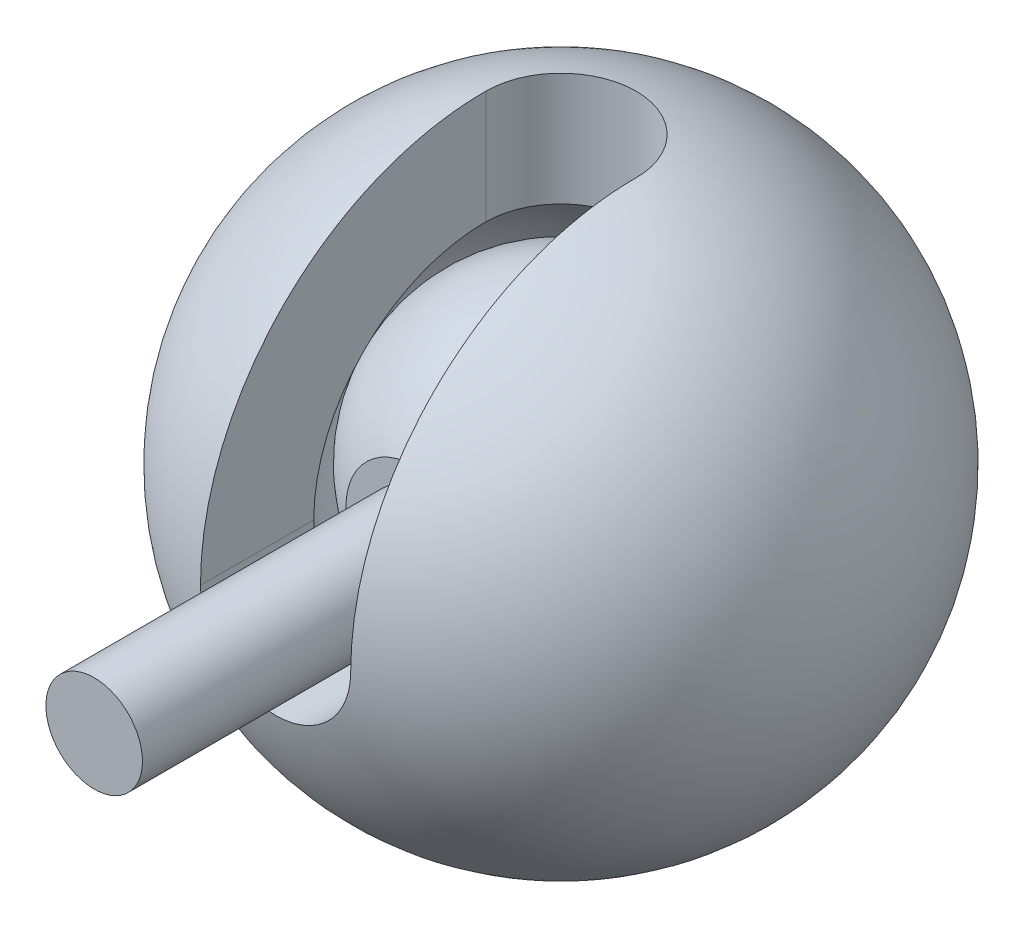
ISO-10303-21;
HEADER;
FILE_DESCRIPTION(('STEP AP214'),'2;1');
FILE_NAME('part.step','',(''),(''),'','','');
FILE_SCHEMA(('AUTOMOTIVE_DESIGN { 1 0 10303 214 1 1 1 1 }'));
ENDSEC;
DATA;
#1=APPLICATION_CONTEXT('core data for automotive mechanical design processes');
#2=APPLICATION_PROTOCOL_DEFINITION('international standard','automotive_design',2000,#1);
#3=PRODUCT_CONTEXT('',#1,'mechanical');
#4=PRODUCT('Part','Part','',(#3));
#5=PRODUCT_RELATED_PRODUCT_CATEGORY('part','',(#4));
#6=PRODUCT_DEFINITION_FORMATION('','',#4);
#7=PRODUCT_DEFINITION_CONTEXT('part definition',#1,'design');
#8=PRODUCT_DEFINITION('design','',#6,#7);
#9=PRODUCT_DEFINITION_SHAPE('','',#8);
#10=(LENGTH_UNIT() NAMED_UNIT(*) SI_UNIT(.MILLI.,.METRE.));
#11=(NAMED_UNIT(*) PLANE_ANGLE_UNIT() SI_UNIT($,.RADIAN.));
#12=(NAMED_UNIT(*) SI_UNIT($,.STERADIAN.) SOLID_ANGLE_UNIT());
#13=UNCERTAINTY_MEASURE_WITH_UNIT(LENGTH_MEASURE(1.E-05),#10,'distance_accuracy_value','');
#14=(GEOMETRIC_REPRESENTATION_CONTEXT(3) GLOBAL_UNCERTAINTY_ASSIGNED_CONTEXT((#13)) GLOBAL_UNIT_ASSIGNED_CONTEXT((#10,
#11,#12)) REPRESENTATION_CONTEXT('',''));
#15=CARTESIAN_POINT('',(0.,0.,0.));
#16=DIRECTION('',(0.,0.,1.));
#17=DIRECTION('',(1.,0.,0.));
#18=AXIS2_PLACEMENT_3D('',#15,#16,#17);
#19=CARTESIAN_POINT('',(0.,0.,0.));
#20=DIRECTION('',(0.,1.,0.));
#21=DIRECTION('',(1.,0.,0.));
#22=AXIS2_PLACEMENT_3D('',#19,#20,#21);
#23=SPHERICAL_SURFACE('',#22,13.75);
#24=CARTESIAN_POINT('',(0.,13.2970861469722,0.));
#25=DIRECTION('',(0.,-1.,0.));
#26=DIRECTION('',(0.,0.,-1.));
#27=AXIS2_PLACEMENT_3D('',#24,#25,#26);
#28=CIRCLE('',#27,3.5);
#29=CARTESIAN_POINT('',(3.5,13.2970861469722,0.));
#30=VERTEX_POINT('',#29);
#31=CARTESIAN_POINT('',(-3.5,13.2970861469722,0.));
#32=VERTEX_POINT('',#31);
#33=EDGE_CURVE('E108',#30,#32,#28,.F.);
#34=ORIENTED_EDGE('',*,*,#33,.F.);
#35=CARTESIAN_POINT('',(3.5,0.,0.));
#36=DIRECTION('',(-1.,0.,0.));
#37=DIRECTION('',(0.,0.,1.));
#38=AXIS2_PLACEMENT_3D('',#35,#36,#37);
#39=CIRCLE('',#38,13.2970861469722);
#40=CARTESIAN_POINT('',(3.5,0.,13.2970861469722));
#41=VERTEX_POINT('',#40);
#42=EDGE_CURVE('E131',#30,#41,#39,.F.);
#43=ORIENTED_EDGE('',*,*,#42,.T.);
#44=CARTESIAN_POINT('',(0.,0.,13.2970861469722));
#45=DIRECTION('',(0.,0.,-1.));
#46=DIRECTION('',(-1.,0.,0.));
#47=AXIS2_PLACEMENT_3D('',#44,#45,#46);
#48=CIRCLE('',#47,3.5);
#49=CARTESIAN_POINT('',(-3.5,0.,13.2970861469722));
#50=VERTEX_POINT('',#49);
#51=EDGE_CURVE('E122',#50,#41,#48,.F.);
#52=ORIENTED_EDGE('',*,*,#51,.F.);
#53=CARTESIAN_POINT('',(-3.5,0.,0.));
#54=DIRECTION('',(1.,0.,0.));
#55=DIRECTION('',(0.,0.,-1.));
#56=AXIS2_PLACEMENT_3D('',#53,#54,#55);
#57=CIRCLE('',#56,13.2970861469722);
#58=EDGE_CURVE('E136',#50,#32,#57,.F.);
#59=ORIENTED_EDGE('',*,*,#58,.T.);
#60=EDGE_LOOP('',(#34,#43,#52,#59));
#61=FACE_BOUND('',#60,.T.);
#62=ADVANCED_FACE('F63',(#61),#23,.T.);
#63=CARTESIAN_POINT('',(0.,0.,0.));
#64=DIRECTION('',(0.,1.,0.));
#65=DIRECTION('',(1.,0.,0.));
#66=AXIS2_PLACEMENT_3D('',#63,#64,#65);
#67=SPHERICAL_SURFACE('',#66,8.75);
#68=CARTESIAN_POINT('',(3.5,0.,0.));
#69=DIRECTION('',(-1.,0.,0.));
#70=DIRECTION('',(0.,0.,1.));
#71=AXIS2_PLACEMENT_3D('',#68,#69,#70);
#72=CIRCLE('',#71,8.01950746617272);
#73=CARTESIAN_POINT('',(3.5,8.01950746617272,0.));
#74=VERTEX_POINT('',#73);
#75=CARTESIAN_POINT('',(3.5,0.,8.01950746617272));
#76=VERTEX_POINT('',#75);
#77=EDGE_CURVE('E12',#74,#76,#72,.F.);
#78=ORIENTED_EDGE('',*,*,#77,.F.);
#79=CARTESIAN_POINT('',(0.,8.01950746617272,0.));
#80=DIRECTION('',(0.,-1.,0.));
#81=DIRECTION('',(0.,0.,-1.));
#82=AXIS2_PLACEMENT_3D('',#79,#80,#81);
#83=CIRCLE('',#82,3.5);
#84=CARTESIAN_POINT('',(-3.5,8.01950746617272,0.));
#85=VERTEX_POINT('',#84);
#86=EDGE_CURVE('E106',#74,#85,#83,.F.);
#87=ORIENTED_EDGE('',*,*,#86,.T.);
#88=CARTESIAN_POINT('',(-3.5,0.,0.));
#89=DIRECTION('',(1.,0.,0.));
#90=DIRECTION('',(0.,0.,-1.));
#91=AXIS2_PLACEMENT_3D('',#88,#89,#90);
#92=CIRCLE('',#91,8.01950746617272);
#93=CARTESIAN_POINT('',(-3.5,0.,8.01950746617272));
#94=VERTEX_POINT('',#93);
#95=EDGE_CURVE('E71',#94,#85,#92,.F.);
#96=ORIENTED_EDGE('',*,*,#95,.F.);
#97=CARTESIAN_POINT('',(0.,0.,8.01950746617272));
#98=DIRECTION('',(0.,0.,-1.));
#99=DIRECTION('',(-1.,0.,0.));
#100=AXIS2_PLACEMENT_3D('',#97,#98,#99);
#101=CIRCLE('',#100,3.5);
#102=EDGE_CURVE('E127',#94,#76,#101,.F.);
#103=ORIENTED_EDGE('',*,*,#102,.T.);
#104=EDGE_LOOP('',(#78,#87,#96,#103));
#105=FACE_BOUND('',#104,.T.);
#106=ADVANCED_FACE('F115',(#105),#67,.F.);
#107=CARTESIAN_POINT('',(0.,0.,6.75));
#108=DIRECTION('',(0.,0.,1.));
#109=DIRECTION('',(1.,0.,0.));
#110=AXIS2_PLACEMENT_3D('',#107,#108,#109);
#111=CYLINDRICAL_SURFACE('',#110,3.5);
#112=ORIENTED_EDGE('',*,*,#51,.T.);
#113=DIRECTION('',(0.,0.,-1.));
#114=VECTOR('',#113,1.);
#115=CARTESIAN_POINT('',(3.5,0.,19.705040631775));
#116=LINE('',#115,#114);
#117=EDGE_CURVE('E111',#41,#76,#116,.T.);
#118=ORIENTED_EDGE('',*,*,#117,.T.);
#119=ORIENTED_EDGE('',*,*,#102,.F.);
#120=DIRECTION('',(0.,0.,1.));
#121=VECTOR('',#120,1.);
#122=CARTESIAN_POINT('',(-3.5,0.,19.705040631775));
#123=LINE('',#122,#121);
#124=EDGE_CURVE('E78',#94,#50,#123,.T.);
#125=ORIENTED_EDGE('',*,*,#124,.T.);
#126=EDGE_LOOP('',(#112,#118,#119,#125));
#127=FACE_BOUND('',#126,.T.);
#128=ADVANCED_FACE('F161',(#127),#111,.F.);
#129=CARTESIAN_POINT('',(3.5,19.705040631775,0.));
#130=DIRECTION('',(-1.,0.,0.));
#131=DIRECTION('',(0.,0.,1.));
#132=AXIS2_PLACEMENT_3D('',#129,#130,#131);
#133=PLANE('',#132);
#134=DIRECTION('',(0.,-1.,0.));
#135=VECTOR('',#134,1.);
#136=CARTESIAN_POINT('',(3.5,19.705040631775,0.));
#137=LINE('',#136,#135);
#138=EDGE_CURVE('E112',#30,#74,#137,.T.);
#139=ORIENTED_EDGE('',*,*,#138,.T.);
#140=ORIENTED_EDGE('',*,*,#77,.T.);
#141=ORIENTED_EDGE('',*,*,#117,.F.);
#142=ORIENTED_EDGE('',*,*,#42,.F.);
#143=EDGE_LOOP('',(#139,#140,#141,#142));
#144=FACE_BOUND('',#143,.T.);
#145=ADVANCED_FACE('F157',(#144),#133,.T.);
#146=CARTESIAN_POINT('',(-3.5,19.705040631775,0.));
#147=DIRECTION('',(1.,0.,0.));
#148=DIRECTION('',(0.,0.,-1.));
#149=AXIS2_PLACEMENT_3D('',#146,#147,#148);
#150=PLANE('',#149);
#151=ORIENTED_EDGE('',*,*,#124,.F.);
#152=ORIENTED_EDGE('',*,*,#95,.T.);
#153=DIRECTION('',(0.,1.,0.));
#154=VECTOR('',#153,1.);
#155=CARTESIAN_POINT('',(-3.5,19.705040631775,0.));
#156=LINE('',#155,#154);
#157=EDGE_CURVE('E103',#85,#32,#156,.T.);
#158=ORIENTED_EDGE('',*,*,#157,.T.);
#159=ORIENTED_EDGE('',*,*,#58,.F.);
#160=EDGE_LOOP('',(#151,#152,#158,#159));
#161=FACE_BOUND('',#160,.T.);
#162=ADVANCED_FACE('F120',(#161),#150,.T.);
#163=CARTESIAN_POINT('',(0.,7.75,0.));
#164=DIRECTION('',(0.,1.,0.));
#165=DIRECTION('',(0.,0.,1.));
#166=AXIS2_PLACEMENT_3D('',#163,#164,#165);
#167=CYLINDRICAL_SURFACE('',#166,3.5);
#168=ORIENTED_EDGE('',*,*,#138,.F.);
#169=ORIENTED_EDGE('',*,*,#33,.T.);
#170=ORIENTED_EDGE('',*,*,#157,.F.);
#171=ORIENTED_EDGE('',*,*,#86,.F.);
#172=EDGE_LOOP('',(#168,#169,#170,#171));
#173=FACE_BOUND('',#172,.T.);
#174=ADVANCED_FACE('F105',(#173),#167,.F.);
#175=CLOSED_SHELL('',(#62,#106,#128,#145,#162,#174));
#176=MANIFOLD_SOLID_BREP('B2',#175);
#177=CARTESIAN_POINT('',(0.,0.,0.));
#178=DIRECTION('',(0.,-1.,0.));
#179=DIRECTION('',(-1.,0.,0.));
#180=AXIS2_PLACEMENT_3D('',#177,#178,#179);
#181=SPHERICAL_SURFACE('',#180,7.5);
#182=CARTESIAN_POINT('',(0.,0.,0.));
#183=DIRECTION('',(0.,0.,1.));
#184=DIRECTION('',(1.,0.,0.));
#185=AXIS2_PLACEMENT_3D('',#182,#183,#184);
#186=SPHERICAL_SURFACE('',#185,7.5);
#187=CARTESIAN_POINT('',(0.,0.,6.75));
#188=DIRECTION('',(0.,0.,1.));
#189=DIRECTION('',(1.,0.,0.));
#190=AXIS2_PLACEMENT_3D('',#187,#188,#189);
#191=CIRCLE('',#190,3.2691742076555);
#192=CARTESIAN_POINT('',(3.2691742076555,0.,6.75));
#193=VERTEX_POINT('',#192);
#194=EDGE_CURVE('E62',#193,#193,#191,.T.);
#195=ORIENTED_EDGE('',*,*,#194,.F.);
#196=EDGE_LOOP('',(#195));
#197=FACE_BOUND('',#196,.T.);
#198=ADVANCED_FACE('F217',(#197),#186,.T.);
#199=CARTESIAN_POINT('',(0.,0.,6.75));
#200=DIRECTION('',(0.,0.,1.));
#201=DIRECTION('',(1.,0.,0.));
#202=AXIS2_PLACEMENT_3D('',#199,#200,#201);
#203=PLANE('',#202);
#204=CARTESIAN_POINT('',(0.,0.,6.75));
#205=DIRECTION('',(0.,0.,1.));
#206=DIRECTION('',(1.,0.,0.));
#207=AXIS2_PLACEMENT_3D('',#204,#205,#206);
#208=CIRCLE('',#207,2.25);
#209=CARTESIAN_POINT('',(2.25,0.,6.75));
#210=VERTEX_POINT('',#209);
#211=EDGE_CURVE('E229',#210,#210,#208,.T.);
#212=ORIENTED_EDGE('',*,*,#211,.F.);
#213=EDGE_LOOP('',(#212));
#214=FACE_BOUND('',#213,.T.);
#215=ORIENTED_EDGE('',*,*,#194,.T.);
#216=EDGE_LOOP('',(#215));
#217=FACE_BOUND('',#216,.T.);
#218=ADVANCED_FACE('F239',(#214,#217),#203,.T.);
#219=CARTESIAN_POINT('',(0.,0.,21.75));
#220=DIRECTION('',(0.,0.,-1.));
#221=DIRECTION('',(-1.,0.,0.));
#222=AXIS2_PLACEMENT_3D('',#219,#220,#221);
#223=CYLINDRICAL_SURFACE('',#222,2.25);
#224=CARTESIAN_POINT('',(0.,0.,21.75));
#225=DIRECTION('',(0.,0.,1.));
#226=DIRECTION('',(1.,0.,0.));
#227=AXIS2_PLACEMENT_3D('',#224,#225,#226);
#228=CIRCLE('',#227,2.25);
#229=CARTESIAN_POINT('',(2.25,0.,21.75));
#230=VERTEX_POINT('',#229);
#231=EDGE_CURVE('E224',#230,#230,#228,.T.);
#232=ORIENTED_EDGE('',*,*,#231,.F.);
#233=EDGE_LOOP('',(#232));
#234=FACE_BOUND('',#233,.T.);
#235=ORIENTED_EDGE('',*,*,#211,.T.);
#236=EDGE_LOOP('',(#235));
#237=FACE_BOUND('',#236,.T.);
#238=ADVANCED_FACE('F237',(#234,#237),#223,.T.);
#239=CARTESIAN_POINT('',(0.,0.,21.75));
#240=DIRECTION('',(0.,0.,1.));
#241=DIRECTION('',(1.,0.,0.));
#242=AXIS2_PLACEMENT_3D('',#239,#240,#241);
#243=PLANE('',#242);
#244=ORIENTED_EDGE('',*,*,#231,.T.);
#245=EDGE_LOOP('',(#244));
#246=FACE_BOUND('',#245,.T.);
#247=ADVANCED_FACE('F245',(#246),#243,.T.);
#248=CLOSED_SHELL('',(#198,#218,#238,#247));
#249=MANIFOLD_SOLID_BREP('B6',#248);
#250=ADVANCED_BREP_SHAPE_REPRESENTATION('',(#18,#176,#249),#14);
#251=SHAPE_DEFINITION_REPRESENTATION(#9,#250);
ENDSEC;
END-ISO-10303-21;
